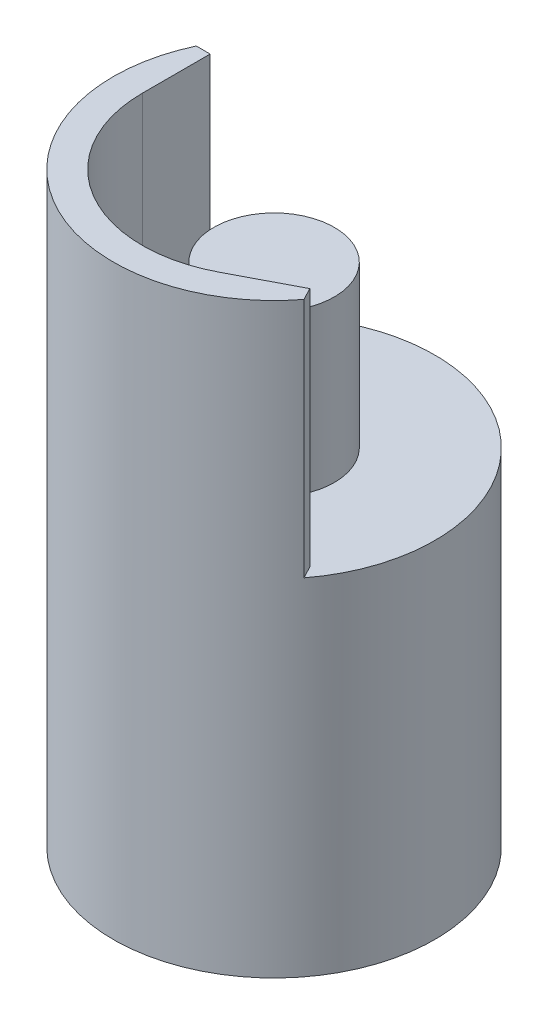
ISO-10303-21;
HEADER;
FILE_DESCRIPTION(('STEP AP214'),'2;1');
FILE_NAME('part.step','',(''),(''),'','','');
FILE_SCHEMA(('AUTOMOTIVE_DESIGN { 1 0 10303 214 1 1 1 1 }'));
ENDSEC;
DATA;
#1=APPLICATION_CONTEXT('core data for automotive mechanical design processes');
#2=APPLICATION_PROTOCOL_DEFINITION('international standard','automotive_design',2000,#1);
#3=PRODUCT_CONTEXT('',#1,'mechanical');
#4=PRODUCT('Part','Part','',(#3));
#5=PRODUCT_RELATED_PRODUCT_CATEGORY('part','',(#4));
#6=PRODUCT_DEFINITION_FORMATION('','',#4);
#7=PRODUCT_DEFINITION_CONTEXT('part definition',#1,'design');
#8=PRODUCT_DEFINITION('design','',#6,#7);
#9=PRODUCT_DEFINITION_SHAPE('','',#8);
#10=(LENGTH_UNIT() NAMED_UNIT(*) SI_UNIT(.MILLI.,.METRE.));
#11=(NAMED_UNIT(*) PLANE_ANGLE_UNIT() SI_UNIT($,.RADIAN.));
#12=(NAMED_UNIT(*) SI_UNIT($,.STERADIAN.) SOLID_ANGLE_UNIT());
#13=UNCERTAINTY_MEASURE_WITH_UNIT(LENGTH_MEASURE(1.E-05),#10,'distance_accuracy_value','');
#14=(GEOMETRIC_REPRESENTATION_CONTEXT(3) GLOBAL_UNCERTAINTY_ASSIGNED_CONTEXT((#13)) GLOBAL_UNIT_ASSIGNED_CONTEXT((#10,
#11,#12)) REPRESENTATION_CONTEXT('',''));
#15=CARTESIAN_POINT('',(0.,0.,0.));
#16=DIRECTION('',(0.,0.,1.));
#17=DIRECTION('',(1.,0.,0.));
#18=AXIS2_PLACEMENT_3D('',#15,#16,#17);
#19=CARTESIAN_POINT('',(0.,21.5,0.));
#20=DIRECTION('',(0.,1.,0.));
#21=DIRECTION('',(0.,0.,1.));
#22=AXIS2_PLACEMENT_3D('',#19,#20,#21);
#23=PLANE('',#22);
#24=CARTESIAN_POINT('',(0.,21.5,0.));
#25=DIRECTION('',(0.,1.,0.));
#26=DIRECTION('',(0.,0.,1.));
#27=AXIS2_PLACEMENT_3D('',#24,#25,#26);
#28=CIRCLE('',#27,3.75);
#29=CARTESIAN_POINT('',(0.,21.5,3.75));
#30=VERTEX_POINT('',#29);
#31=EDGE_CURVE('E179',#30,#30,#28,.T.);
#32=ORIENTED_EDGE('',*,*,#31,.F.);
#33=EDGE_LOOP('',(#32));
#34=FACE_BOUND('',#33,.T.);
#35=DIRECTION('',(0.886548676949594,0.,-0.462635324417542));
#36=VECTOR('',#35,1.);
#37=CARTESIAN_POINT('',(3.7934964172546,21.5,7.26948214333669));
#38=LINE('',#37,#36);
#39=CARTESIAN_POINT('',(3.84966681484434,21.5,7.24017026144318));
#40=VERTEX_POINT('',#39);
#41=CARTESIAN_POINT('',(7.53826550640538,21.5,5.31531706760836));
#42=VERTEX_POINT('',#41);
#43=EDGE_CURVE('E193',#40,#42,#38,.T.);
#44=ORIENTED_EDGE('',*,*,#43,.T.);
#45=DIRECTION('',(0.462635324417541,0.,0.886548676949594));
#46=VECTOR('',#45,1.);
#47=CARTESIAN_POINT('',(3.74476908915078,21.5,-1.95416507572833));
#48=LINE('',#47,#46);
#49=CARTESIAN_POINT('',(7.9381428140525,21.5,6.08160247498196));
#50=VERTEX_POINT('',#49);
#51=EDGE_CURVE('E221',#42,#50,#48,.T.);
#52=ORIENTED_EDGE('',*,*,#51,.T.);
#53=CARTESIAN_POINT('',(0.,21.5,0.));
#54=DIRECTION('',(0.,1.,0.));
#55=DIRECTION('',(0.,0.,1.));
#56=AXIS2_PLACEMENT_3D('',#53,#54,#55);
#57=CIRCLE('',#56,10.);
#58=CARTESIAN_POINT('',(-9.06426531085145,21.5,-4.22363520850168));
#59=VERTEX_POINT('',#58);
#60=EDGE_CURVE('E12',#50,#59,#57,.T.);
#61=ORIENTED_EDGE('',*,*,#60,.T.);
#62=DIRECTION('',(-1.,0.,0.));
#63=VECTOR('',#62,1.);
#64=CARTESIAN_POINT('',(0.,21.5,-4.22363520850168));
#65=LINE('',#64,#63);
#66=CARTESIAN_POINT('',(-8.2,21.5,-4.22363520850168));
#67=VERTEX_POINT('',#66);
#68=EDGE_CURVE('E217',#67,#59,#65,.T.);
#69=ORIENTED_EDGE('',*,*,#68,.F.);
#70=DIRECTION('',(0.,0.,-1.));
#71=VECTOR('',#70,1.);
#72=CARTESIAN_POINT('',(-8.2,21.5,0.));
#73=LINE('',#72,#71);
#74=CARTESIAN_POINT('',(-8.2,21.5,0.));
#75=VERTEX_POINT('',#74);
#76=EDGE_CURVE('E213',#75,#67,#73,.T.);
#77=ORIENTED_EDGE('',*,*,#76,.F.);
#78=CARTESIAN_POINT('',(0.,21.5,0.));
#79=DIRECTION('',(0.,1.,0.));
#80=DIRECTION('',(0.,0.,1.));
#81=AXIS2_PLACEMENT_3D('',#78,#79,#80);
#82=CIRCLE('',#81,8.2);
#83=EDGE_CURVE('E184',#75,#40,#82,.T.);
#84=ORIENTED_EDGE('',*,*,#83,.T.);
#85=EDGE_LOOP('',(#44,#52,#61,#69,#77,#84));
#86=FACE_BOUND('',#85,.T.);
#87=ADVANCED_FACE('F59',(#34,#86),#23,.T.);
#88=CARTESIAN_POINT('',(0.,0.,0.));
#89=DIRECTION('',(0.,1.,0.));
#90=DIRECTION('',(0.,0.,1.));
#91=AXIS2_PLACEMENT_3D('',#88,#89,#90);
#92=PLANE('',#91);
#93=CARTESIAN_POINT('',(0.,0.,0.));
#94=DIRECTION('',(0.,1.,0.));
#95=DIRECTION('',(0.,0.,1.));
#96=AXIS2_PLACEMENT_3D('',#93,#94,#95);
#97=CIRCLE('',#96,10.);
#98=CARTESIAN_POINT('',(-10.,0.,0.));
#99=VERTEX_POINT('',#98);
#100=CARTESIAN_POINT('',(-0.523359562429444,0.,-9.98629534754574));
#101=VERTEX_POINT('',#100);
#102=EDGE_CURVE('E63',#99,#101,#97,.T.);
#103=ORIENTED_EDGE('',*,*,#102,.F.);
#104=DIRECTION('',(1.,0.,0.));
#105=VECTOR('',#104,1.);
#106=CARTESIAN_POINT('',(0.,0.,0.));
#107=LINE('',#106,#105);
#108=CARTESIAN_POINT('',(-13.,0.,0.));
#109=VERTEX_POINT('',#108);
#110=EDGE_CURVE('E169',#109,#99,#107,.T.);
#111=ORIENTED_EDGE('',*,*,#110,.F.);
#112=CARTESIAN_POINT('',(0.,0.,0.));
#113=DIRECTION('',(0.,1.,0.));
#114=DIRECTION('',(0.,0.,1.));
#115=AXIS2_PLACEMENT_3D('',#112,#113,#114);
#116=CIRCLE('',#115,13.);
#117=CARTESIAN_POINT('',(-0.680367431158277,0.,-12.9821839518095));
#118=VERTEX_POINT('',#117);
#119=EDGE_CURVE('E166',#109,#118,#116,.F.);
#120=ORIENTED_EDGE('',*,*,#119,.T.);
#121=DIRECTION('',(0.0523359562429444,0.,0.998629534754574));
#122=VECTOR('',#121,1.);
#123=CARTESIAN_POINT('',(0.,0.,0.));
#124=LINE('',#123,#122);
#125=EDGE_CURVE('E140',#118,#101,#124,.T.);
#126=ORIENTED_EDGE('',*,*,#125,.T.);
#127=EDGE_LOOP('',(#103,#111,#120,#126));
#128=FACE_BOUND('',#127,.T.);
#129=ADVANCED_FACE('F255',(#128),#92,.F.);
#130=CARTESIAN_POINT('',(0.,21.5,0.));
#131=DIRECTION('',(0.,-1.,0.));
#132=DIRECTION('',(0.,0.,-1.));
#133=AXIS2_PLACEMENT_3D('',#130,#131,#132);
#134=CYLINDRICAL_SURFACE('',#133,10.);
#135=ORIENTED_EDGE('',*,*,#60,.F.);
#136=DIRECTION('',(0.,-1.,0.));
#137=VECTOR('',#136,1.);
#138=CARTESIAN_POINT('',(7.9381428140525,36.5,6.08160247498196));
#139=LINE('',#138,#137);
#140=CARTESIAN_POINT('',(7.9381428140525,36.5,6.08160247498196));
#141=VERTEX_POINT('',#140);
#142=EDGE_CURVE('E233',#141,#50,#139,.T.);
#143=ORIENTED_EDGE('',*,*,#142,.F.);
#144=CARTESIAN_POINT('',(0.,36.5,0.));
#145=DIRECTION('',(0.,1.,0.));
#146=DIRECTION('',(0.,0.,1.));
#147=AXIS2_PLACEMENT_3D('',#144,#145,#146);
#148=CIRCLE('',#147,10.);
#149=CARTESIAN_POINT('',(-9.06426531085145,36.5,-4.22363520850168));
#150=VERTEX_POINT('',#149);
#151=EDGE_CURVE('E199',#150,#141,#148,.T.);
#152=ORIENTED_EDGE('',*,*,#151,.F.);
#153=DIRECTION('',(0.,-1.,0.));
#154=VECTOR('',#153,1.);
#155=CARTESIAN_POINT('',(-9.06426531085145,36.5,-4.22363520850168));
#156=LINE('',#155,#154);
#157=EDGE_CURVE('E237',#150,#59,#156,.T.);
#158=ORIENTED_EDGE('',*,*,#157,.T.);
#159=EDGE_LOOP('',(#135,#143,#152,#158));
#160=FACE_BOUND('',#159,.T.);
#161=ORIENTED_EDGE('',*,*,#102,.T.);
#162=DIRECTION('',(0.,-1.,0.));
#163=VECTOR('',#162,1.);
#164=CARTESIAN_POINT('',(-0.523359562429444,1.5,-9.98629534754574));
#165=LINE('',#164,#163);
#166=CARTESIAN_POINT('',(-0.523359562429444,1.5,-9.98629534754574));
#167=VERTEX_POINT('',#166);
#168=EDGE_CURVE('E80',#167,#101,#165,.T.);
#169=ORIENTED_EDGE('',*,*,#168,.F.);
#170=CARTESIAN_POINT('',(0.,1.5,0.));
#171=DIRECTION('',(0.,1.,0.));
#172=DIRECTION('',(0.,0.,1.));
#173=AXIS2_PLACEMENT_3D('',#170,#171,#172);
#174=CIRCLE('',#173,10.);
#175=CARTESIAN_POINT('',(-10.,1.5,0.));
#176=VERTEX_POINT('',#175);
#177=EDGE_CURVE('E75',#167,#176,#174,.T.);
#178=ORIENTED_EDGE('',*,*,#177,.T.);
#179=DIRECTION('',(0.,-1.,0.));
#180=VECTOR('',#179,1.);
#181=CARTESIAN_POINT('',(-10.,1.5,0.));
#182=LINE('',#181,#180);
#183=EDGE_CURVE('E160',#176,#99,#182,.T.);
#184=ORIENTED_EDGE('',*,*,#183,.T.);
#185=EDGE_LOOP('',(#161,#169,#178,#184));
#186=FACE_BOUND('',#185,.T.);
#187=ADVANCED_FACE('F61',(#160,#186),#134,.T.);
#188=CARTESIAN_POINT('',(0.,36.5,0.));
#189=DIRECTION('',(0.,-1.,0.));
#190=DIRECTION('',(0.,0.,-1.));
#191=AXIS2_PLACEMENT_3D('',#188,#189,#190);
#192=CYLINDRICAL_SURFACE('',#191,8.2);
#193=ORIENTED_EDGE('',*,*,#83,.F.);
#194=DIRECTION('',(0.,-1.,0.));
#195=VECTOR('',#194,1.);
#196=CARTESIAN_POINT('',(-8.2,36.5,0.));
#197=LINE('',#196,#195);
#198=CARTESIAN_POINT('',(-8.2,36.5,0.));
#199=VERTEX_POINT('',#198);
#200=EDGE_CURVE('E245',#199,#75,#197,.T.);
#201=ORIENTED_EDGE('',*,*,#200,.F.);
#202=CARTESIAN_POINT('',(0.,36.5,0.));
#203=DIRECTION('',(0.,1.,0.));
#204=DIRECTION('',(0.,0.,1.));
#205=AXIS2_PLACEMENT_3D('',#202,#203,#204);
#206=CIRCLE('',#205,8.2);
#207=CARTESIAN_POINT('',(3.84966681484434,36.5,7.24017026144318));
#208=VERTEX_POINT('',#207);
#209=EDGE_CURVE('E188',#199,#208,#206,.T.);
#210=ORIENTED_EDGE('',*,*,#209,.T.);
#211=DIRECTION('',(0.,-1.,0.));
#212=VECTOR('',#211,1.);
#213=CARTESIAN_POINT('',(3.84966681484434,36.5,7.24017026144318));
#214=LINE('',#213,#212);
#215=EDGE_CURVE('E210',#208,#40,#214,.T.);
#216=ORIENTED_EDGE('',*,*,#215,.T.);
#217=EDGE_LOOP('',(#193,#201,#210,#216));
#218=FACE_BOUND('',#217,.T.);
#219=ADVANCED_FACE('F272',(#218),#192,.F.);
#220=CARTESIAN_POINT('',(-8.2,36.5,0.));
#221=DIRECTION('',(-1.,0.,0.));
#222=DIRECTION('',(0.,0.,1.));
#223=AXIS2_PLACEMENT_3D('',#220,#221,#222);
#224=PLANE('',#223);
#225=ORIENTED_EDGE('',*,*,#76,.T.);
#226=DIRECTION('',(0.,-1.,0.));
#227=VECTOR('',#226,1.);
#228=CARTESIAN_POINT('',(-8.2,36.5,-4.22363520850168));
#229=LINE('',#228,#227);
#230=CARTESIAN_POINT('',(-8.2,36.5,-4.22363520850168));
#231=VERTEX_POINT('',#230);
#232=EDGE_CURVE('E241',#231,#67,#229,.T.);
#233=ORIENTED_EDGE('',*,*,#232,.F.);
#234=DIRECTION('',(0.,0.,-1.));
#235=VECTOR('',#234,1.);
#236=CARTESIAN_POINT('',(-8.2,36.5,0.));
#237=LINE('',#236,#235);
#238=EDGE_CURVE('E192',#199,#231,#237,.T.);
#239=ORIENTED_EDGE('',*,*,#238,.F.);
#240=ORIENTED_EDGE('',*,*,#200,.T.);
#241=EDGE_LOOP('',(#225,#233,#239,#240));
#242=FACE_BOUND('',#241,.T.);
#243=ADVANCED_FACE('F281',(#242),#224,.F.);
#244=CARTESIAN_POINT('',(0.,36.5,-4.22363520850168));
#245=DIRECTION('',(0.,0.,1.));
#246=DIRECTION('',(1.,0.,0.));
#247=AXIS2_PLACEMENT_3D('',#244,#245,#246);
#248=PLANE('',#247);
#249=ORIENTED_EDGE('',*,*,#68,.T.);
#250=ORIENTED_EDGE('',*,*,#157,.F.);
#251=DIRECTION('',(-1.,0.,0.));
#252=VECTOR('',#251,1.);
#253=CARTESIAN_POINT('',(0.,36.5,-4.22363520850168));
#254=LINE('',#253,#252);
#255=EDGE_CURVE('E196',#231,#150,#254,.T.);
#256=ORIENTED_EDGE('',*,*,#255,.F.);
#257=ORIENTED_EDGE('',*,*,#232,.T.);
#258=EDGE_LOOP('',(#249,#250,#256,#257));
#259=FACE_BOUND('',#258,.T.);
#260=ADVANCED_FACE('F301',(#259),#248,.F.);
#261=CARTESIAN_POINT('',(3.74476908915078,36.5,-1.95416507572833));
#262=DIRECTION('',(0.886548676949594,0.,-0.462635324417541));
#263=DIRECTION('',(-0.462635324417541,0.,-0.886548676949594));
#264=AXIS2_PLACEMENT_3D('',#261,#262,#263);
#265=PLANE('',#264);
#266=ORIENTED_EDGE('',*,*,#51,.F.);
#267=DIRECTION('',(0.,-1.,0.));
#268=VECTOR('',#267,1.);
#269=CARTESIAN_POINT('',(7.53826550640538,36.5,5.31531706760836));
#270=LINE('',#269,#268);
#271=CARTESIAN_POINT('',(7.53826550640538,36.5,5.31531706760836));
#272=VERTEX_POINT('',#271);
#273=EDGE_CURVE('E229',#272,#42,#270,.T.);
#274=ORIENTED_EDGE('',*,*,#273,.F.);
#275=DIRECTION('',(0.462635324417541,0.,0.886548676949594));
#276=VECTOR('',#275,1.);
#277=CARTESIAN_POINT('',(3.74476908915078,36.5,-1.95416507572833));
#278=LINE('',#277,#276);
#279=EDGE_CURVE('E202',#272,#141,#278,.T.);
#280=ORIENTED_EDGE('',*,*,#279,.T.);
#281=ORIENTED_EDGE('',*,*,#142,.T.);
#282=EDGE_LOOP('',(#266,#274,#280,#281));
#283=FACE_BOUND('',#282,.T.);
#284=ADVANCED_FACE('F289',(#283),#265,.T.);
#285=CARTESIAN_POINT('',(3.7934964172546,36.5,7.26948214333669));
#286=DIRECTION('',(-0.462635324417542,0.,-0.886548676949594));
#287=DIRECTION('',(-0.886548676949594,0.,0.462635324417542));
#288=AXIS2_PLACEMENT_3D('',#285,#286,#287);
#289=PLANE('',#288);
#290=ORIENTED_EDGE('',*,*,#43,.F.);
#291=ORIENTED_EDGE('',*,*,#215,.F.);
#292=DIRECTION('',(0.886548676949594,0.,-0.462635324417542));
#293=VECTOR('',#292,1.);
#294=CARTESIAN_POINT('',(3.7934964172546,36.5,7.26948214333669));
#295=LINE('',#294,#293);
#296=EDGE_CURVE('E206',#208,#272,#295,.T.);
#297=ORIENTED_EDGE('',*,*,#296,.T.);
#298=ORIENTED_EDGE('',*,*,#273,.T.);
#299=EDGE_LOOP('',(#290,#291,#297,#298));
#300=FACE_BOUND('',#299,.T.);
#301=ADVANCED_FACE('F297',(#300),#289,.T.);
#302=CARTESIAN_POINT('',(0.,36.5,0.));
#303=DIRECTION('',(0.,1.,0.));
#304=DIRECTION('',(0.,0.,1.));
#305=AXIS2_PLACEMENT_3D('',#302,#303,#304);
#306=PLANE('',#305);
#307=ORIENTED_EDGE('',*,*,#209,.F.);
#308=ORIENTED_EDGE('',*,*,#238,.T.);
#309=ORIENTED_EDGE('',*,*,#255,.T.);
#310=ORIENTED_EDGE('',*,*,#151,.T.);
#311=ORIENTED_EDGE('',*,*,#279,.F.);
#312=ORIENTED_EDGE('',*,*,#296,.F.);
#313=EDGE_LOOP('',(#307,#308,#309,#310,#311,#312));
#314=FACE_BOUND('',#313,.T.);
#315=ADVANCED_FACE('F294',(#314),#306,.T.);
#316=CARTESIAN_POINT('',(0.,31.5,0.));
#317=DIRECTION('',(0.,-1.,0.));
#318=DIRECTION('',(0.,0.,-1.));
#319=AXIS2_PLACEMENT_3D('',#316,#317,#318);
#320=CYLINDRICAL_SURFACE('',#319,3.75);
#321=CARTESIAN_POINT('',(0.,31.5,0.));
#322=DIRECTION('',(0.,1.,0.));
#323=DIRECTION('',(0.,0.,1.));
#324=AXIS2_PLACEMENT_3D('',#321,#322,#323);
#325=CIRCLE('',#324,3.75);
#326=CARTESIAN_POINT('',(0.,31.5,3.75));
#327=VERTEX_POINT('',#326);
#328=EDGE_CURVE('E180',#327,#327,#325,.T.);
#329=ORIENTED_EDGE('',*,*,#328,.F.);
#330=EDGE_LOOP('',(#329));
#331=FACE_BOUND('',#330,.T.);
#332=ORIENTED_EDGE('',*,*,#31,.T.);
#333=EDGE_LOOP('',(#332));
#334=FACE_BOUND('',#333,.T.);
#335=ADVANCED_FACE('F315',(#331,#334),#320,.T.);
#336=CARTESIAN_POINT('',(0.,31.5,0.));
#337=DIRECTION('',(0.,1.,0.));
#338=DIRECTION('',(0.,0.,1.));
#339=AXIS2_PLACEMENT_3D('',#336,#337,#338);
#340=PLANE('',#339);
#341=ORIENTED_EDGE('',*,*,#328,.T.);
#342=EDGE_LOOP('',(#341));
#343=FACE_BOUND('',#342,.T.);
#344=ADVANCED_FACE('F318',(#343),#340,.T.);
#345=CARTESIAN_POINT('',(0.,1.5,0.));
#346=DIRECTION('',(0.998629534754574,0.,-0.0523359562429444));
#347=DIRECTION('',(-0.0523359562429444,0.,-0.998629534754574));
#348=AXIS2_PLACEMENT_3D('',#345,#346,#347);
#349=PLANE('',#348);
#350=ORIENTED_EDGE('',*,*,#125,.F.);
#351=DIRECTION('',(0.,-1.,0.));
#352=VECTOR('',#351,1.);
#353=CARTESIAN_POINT('',(-0.680367431158277,1.5,-12.9821839518095));
#354=LINE('',#353,#352);
#355=CARTESIAN_POINT('',(-0.680367431158277,1.5,-12.9821839518095));
#356=VERTEX_POINT('',#355);
#357=EDGE_CURVE('E135',#356,#118,#354,.T.);
#358=ORIENTED_EDGE('',*,*,#357,.F.);
#359=DIRECTION('',(0.0523359562429444,0.,0.998629534754574));
#360=VECTOR('',#359,1.);
#361=CARTESIAN_POINT('',(0.,1.5,0.));
#362=LINE('',#361,#360);
#363=EDGE_CURVE('E138',#356,#167,#362,.T.);
#364=ORIENTED_EDGE('',*,*,#363,.T.);
#365=ORIENTED_EDGE('',*,*,#168,.T.);
#366=EDGE_LOOP('',(#350,#358,#364,#365));
#367=FACE_BOUND('',#366,.T.);
#368=ADVANCED_FACE('F137',(#367),#349,.T.);
#369=CARTESIAN_POINT('',(0.,1.5,0.));
#370=DIRECTION('',(0.,-1.,0.));
#371=DIRECTION('',(0.,0.,-1.));
#372=AXIS2_PLACEMENT_3D('',#369,#370,#371);
#373=CYLINDRICAL_SURFACE('',#372,13.);
#374=ORIENTED_EDGE('',*,*,#119,.F.);
#375=DIRECTION('',(0.,-1.,0.));
#376=VECTOR('',#375,1.);
#377=CARTESIAN_POINT('',(-13.,1.5,0.));
#378=LINE('',#377,#376);
#379=CARTESIAN_POINT('',(-13.,1.5,0.));
#380=VERTEX_POINT('',#379);
#381=EDGE_CURVE('E146',#380,#109,#378,.T.);
#382=ORIENTED_EDGE('',*,*,#381,.F.);
#383=CARTESIAN_POINT('',(0.,1.5,0.));
#384=DIRECTION('',(0.,1.,0.));
#385=DIRECTION('',(0.,0.,1.));
#386=AXIS2_PLACEMENT_3D('',#383,#384,#385);
#387=CIRCLE('',#386,13.);
#388=EDGE_CURVE('E151',#380,#356,#387,.F.);
#389=ORIENTED_EDGE('',*,*,#388,.T.);
#390=ORIENTED_EDGE('',*,*,#357,.T.);
#391=EDGE_LOOP('',(#374,#382,#389,#390));
#392=FACE_BOUND('',#391,.T.);
#393=ADVANCED_FACE('F154',(#392),#373,.T.);
#394=CARTESIAN_POINT('',(0.,1.5,0.));
#395=DIRECTION('',(0.,0.,-1.));
#396=DIRECTION('',(-1.,0.,0.));
#397=AXIS2_PLACEMENT_3D('',#394,#395,#396);
#398=PLANE('',#397);
#399=ORIENTED_EDGE('',*,*,#110,.T.);
#400=ORIENTED_EDGE('',*,*,#183,.F.);
#401=DIRECTION('',(1.,0.,0.));
#402=VECTOR('',#401,1.);
#403=CARTESIAN_POINT('',(0.,1.5,0.));
#404=LINE('',#403,#402);
#405=EDGE_CURVE('E157',#380,#176,#404,.T.);
#406=ORIENTED_EDGE('',*,*,#405,.F.);
#407=ORIENTED_EDGE('',*,*,#381,.T.);
#408=EDGE_LOOP('',(#399,#400,#406,#407));
#409=FACE_BOUND('',#408,.T.);
#410=ADVANCED_FACE('F257',(#409),#398,.F.);
#411=CARTESIAN_POINT('',(0.,1.5,0.));
#412=DIRECTION('',(0.,1.,0.));
#413=DIRECTION('',(0.,0.,1.));
#414=AXIS2_PLACEMENT_3D('',#411,#412,#413);
#415=PLANE('',#414);
#416=ORIENTED_EDGE('',*,*,#177,.F.);
#417=ORIENTED_EDGE('',*,*,#363,.F.);
#418=ORIENTED_EDGE('',*,*,#388,.F.);
#419=ORIENTED_EDGE('',*,*,#405,.T.);
#420=EDGE_LOOP('',(#416,#417,#418,#419));
#421=FACE_BOUND('',#420,.T.);
#422=ADVANCED_FACE('F150',(#421),#415,.T.);
#423=CLOSED_SHELL('',(#87,#129,#187,#219,#243,#260,#284,#301,#315,#335,#344,#368,#393,#410,#422));
#424=MANIFOLD_SOLID_BREP('B2',#423);
#425=ADVANCED_BREP_SHAPE_REPRESENTATION('',(#18,#424),#14);
#426=SHAPE_DEFINITION_REPRESENTATION(#9,#425);
ENDSEC;
END-ISO-10303-21;
